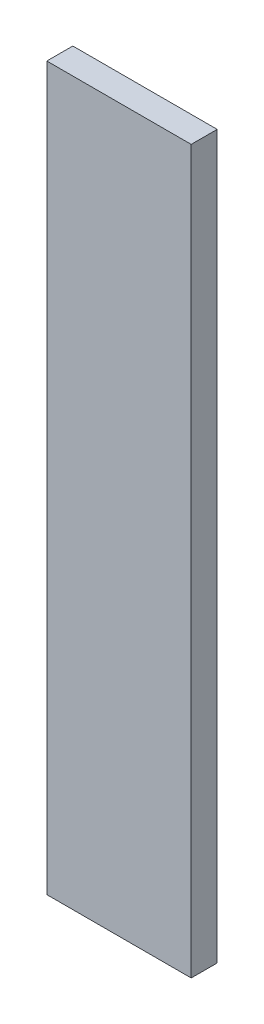
ISO-10303-21;
HEADER;
FILE_DESCRIPTION(('STEP AP214'),'2;1');
FILE_NAME('part.step','',(''),(''),'','','');
FILE_SCHEMA(('AUTOMOTIVE_DESIGN { 1 0 10303 214 1 1 1 1 }'));
ENDSEC;
DATA;
#1=APPLICATION_CONTEXT('core data for automotive mechanical design processes');
#2=APPLICATION_PROTOCOL_DEFINITION('international standard','automotive_design',2000,#1);
#3=PRODUCT_CONTEXT('',#1,'mechanical');
#4=PRODUCT('Part','Part','',(#3));
#5=PRODUCT_RELATED_PRODUCT_CATEGORY('part','',(#4));
#6=PRODUCT_DEFINITION_FORMATION('','',#4);
#7=PRODUCT_DEFINITION_CONTEXT('part definition',#1,'design');
#8=PRODUCT_DEFINITION('design','',#6,#7);
#9=PRODUCT_DEFINITION_SHAPE('','',#8);
#10=(LENGTH_UNIT() NAMED_UNIT(*) SI_UNIT(.MILLI.,.METRE.));
#11=(NAMED_UNIT(*) PLANE_ANGLE_UNIT() SI_UNIT($,.RADIAN.));
#12=(NAMED_UNIT(*) SI_UNIT($,.STERADIAN.) SOLID_ANGLE_UNIT());
#13=UNCERTAINTY_MEASURE_WITH_UNIT(LENGTH_MEASURE(1.E-05),#10,'distance_accuracy_value','');
#14=(GEOMETRIC_REPRESENTATION_CONTEXT(3) GLOBAL_UNCERTAINTY_ASSIGNED_CONTEXT((#13)) GLOBAL_UNIT_ASSIGNED_CONTEXT((#10,
#11,#12)) REPRESENTATION_CONTEXT('',''));
#15=CARTESIAN_POINT('',(0.,0.,0.));
#16=DIRECTION('',(0.,0.,1.));
#17=DIRECTION('',(1.,0.,0.));
#18=AXIS2_PLACEMENT_3D('',#15,#16,#17);
#19=CARTESIAN_POINT('',(0.,500.,0.));
#20=DIRECTION('',(1.,0.,0.));
#21=DIRECTION('',(0.,0.,-1.));
#22=AXIS2_PLACEMENT_3D('',#19,#20,#21);
#23=PLANE('',#22);
#24=DIRECTION('',(0.,0.,1.));
#25=VECTOR('',#24,1.);
#26=CARTESIAN_POINT('',(0.,0.,0.));
#27=LINE('',#26,#25);
#28=CARTESIAN_POINT('',(0.,0.,-18.));
#29=VERTEX_POINT('',#28);
#30=CARTESIAN_POINT('',(0.,0.,0.));
#31=VERTEX_POINT('',#30);
#32=EDGE_CURVE('E96',#29,#31,#27,.T.);
#33=ORIENTED_EDGE('',*,*,#32,.T.);
#34=DIRECTION('',(0.,-1.,0.));
#35=VECTOR('',#34,1.);
#36=CARTESIAN_POINT('',(0.,500.,0.));
#37=LINE('',#36,#35);
#38=CARTESIAN_POINT('',(0.,500.,0.));
#39=VERTEX_POINT('',#38);
#40=EDGE_CURVE('E11',#39,#31,#37,.T.);
#41=ORIENTED_EDGE('',*,*,#40,.F.);
#42=DIRECTION('',(0.,0.,1.));
#43=VECTOR('',#42,1.);
#44=CARTESIAN_POINT('',(0.,500.,0.));
#45=LINE('',#44,#43);
#46=CARTESIAN_POINT('',(0.,500.,-18.));
#47=VERTEX_POINT('',#46);
#48=EDGE_CURVE('E84',#47,#39,#45,.T.);
#49=ORIENTED_EDGE('',*,*,#48,.F.);
#50=DIRECTION('',(0.,-1.,0.));
#51=VECTOR('',#50,1.);
#52=CARTESIAN_POINT('',(0.,500.,-18.));
#53=LINE('',#52,#51);
#54=EDGE_CURVE('E92',#47,#29,#53,.T.);
#55=ORIENTED_EDGE('',*,*,#54,.T.);
#56=EDGE_LOOP('',(#33,#41,#49,#55));
#57=FACE_BOUND('',#56,.T.);
#58=ADVANCED_FACE('F33',(#57),#23,.F.);
#59=CARTESIAN_POINT('',(0.,500.,0.));
#60=DIRECTION('',(0.,0.,-1.));
#61=DIRECTION('',(-1.,0.,0.));
#62=AXIS2_PLACEMENT_3D('',#59,#60,#61);
#63=PLANE('',#62);
#64=DIRECTION('',(1.,0.,0.));
#65=VECTOR('',#64,1.);
#66=CARTESIAN_POINT('',(0.,0.,0.));
#67=LINE('',#66,#65);
#68=CARTESIAN_POINT('',(100.,0.,0.));
#69=VERTEX_POINT('',#68);
#70=EDGE_CURVE('E88',#31,#69,#67,.T.);
#71=ORIENTED_EDGE('',*,*,#70,.T.);
#72=DIRECTION('',(0.,-1.,0.));
#73=VECTOR('',#72,1.);
#74=CARTESIAN_POINT('',(100.,500.,0.));
#75=LINE('',#74,#73);
#76=CARTESIAN_POINT('',(100.,500.,0.));
#77=VERTEX_POINT('',#76);
#78=EDGE_CURVE('E41',#77,#69,#75,.T.);
#79=ORIENTED_EDGE('',*,*,#78,.F.);
#80=DIRECTION('',(1.,0.,0.));
#81=VECTOR('',#80,1.);
#82=CARTESIAN_POINT('',(0.,500.,0.));
#83=LINE('',#82,#81);
#84=EDGE_CURVE('E79',#39,#77,#83,.T.);
#85=ORIENTED_EDGE('',*,*,#84,.F.);
#86=ORIENTED_EDGE('',*,*,#40,.T.);
#87=EDGE_LOOP('',(#71,#79,#85,#86));
#88=FACE_BOUND('',#87,.T.);
#89=ADVANCED_FACE('F87',(#88),#63,.F.);
#90=CARTESIAN_POINT('',(100.,500.,0.));
#91=DIRECTION('',(-1.,0.,0.));
#92=DIRECTION('',(0.,0.,1.));
#93=AXIS2_PLACEMENT_3D('',#90,#91,#92);
#94=PLANE('',#93);
#95=DIRECTION('',(0.,0.,-1.));
#96=VECTOR('',#95,1.);
#97=CARTESIAN_POINT('',(100.,0.,0.));
#98=LINE('',#97,#96);
#99=CARTESIAN_POINT('',(100.,0.,-18.));
#100=VERTEX_POINT('',#99);
#101=EDGE_CURVE('E66',#69,#100,#98,.T.);
#102=ORIENTED_EDGE('',*,*,#101,.T.);
#103=DIRECTION('',(0.,-1.,0.));
#104=VECTOR('',#103,1.);
#105=CARTESIAN_POINT('',(100.,500.,-18.));
#106=LINE('',#105,#104);
#107=CARTESIAN_POINT('',(100.,500.,-18.));
#108=VERTEX_POINT('',#107);
#109=EDGE_CURVE('E89',#108,#100,#106,.T.);
#110=ORIENTED_EDGE('',*,*,#109,.F.);
#111=DIRECTION('',(0.,0.,-1.));
#112=VECTOR('',#111,1.);
#113=CARTESIAN_POINT('',(100.,500.,0.));
#114=LINE('',#113,#112);
#115=EDGE_CURVE('E82',#77,#108,#114,.T.);
#116=ORIENTED_EDGE('',*,*,#115,.F.);
#117=ORIENTED_EDGE('',*,*,#78,.T.);
#118=EDGE_LOOP('',(#102,#110,#116,#117));
#119=FACE_BOUND('',#118,.T.);
#120=ADVANCED_FACE('F90',(#119),#94,.F.);
#121=CARTESIAN_POINT('',(0.,500.,-18.));
#122=DIRECTION('',(0.,0.,1.));
#123=DIRECTION('',(1.,0.,0.));
#124=AXIS2_PLACEMENT_3D('',#121,#122,#123);
#125=PLANE('',#124);
#126=DIRECTION('',(-1.,0.,0.));
#127=VECTOR('',#126,1.);
#128=CARTESIAN_POINT('',(0.,0.,-18.));
#129=LINE('',#128,#127);
#130=EDGE_CURVE('E72',#100,#29,#129,.T.);
#131=ORIENTED_EDGE('',*,*,#130,.T.);
#132=ORIENTED_EDGE('',*,*,#54,.F.);
#133=DIRECTION('',(-1.,0.,0.));
#134=VECTOR('',#133,1.);
#135=CARTESIAN_POINT('',(0.,500.,-18.));
#136=LINE('',#135,#134);
#137=EDGE_CURVE('E49',#108,#47,#136,.T.);
#138=ORIENTED_EDGE('',*,*,#137,.F.);
#139=ORIENTED_EDGE('',*,*,#109,.T.);
#140=EDGE_LOOP('',(#131,#132,#138,#139));
#141=FACE_BOUND('',#140,.T.);
#142=ADVANCED_FACE('F103',(#141),#125,.F.);
#143=CARTESIAN_POINT('',(0.,500.,0.));
#144=DIRECTION('',(0.,-1.,0.));
#145=DIRECTION('',(0.,0.,-1.));
#146=AXIS2_PLACEMENT_3D('',#143,#144,#145);
#147=PLANE('',#146);
#148=ORIENTED_EDGE('',*,*,#48,.T.);
#149=ORIENTED_EDGE('',*,*,#84,.T.);
#150=ORIENTED_EDGE('',*,*,#115,.T.);
#151=ORIENTED_EDGE('',*,*,#137,.T.);
#152=EDGE_LOOP('',(#148,#149,#150,#151));
#153=FACE_BOUND('',#152,.T.);
#154=ADVANCED_FACE('F80',(#153),#147,.F.);
#155=CARTESIAN_POINT('',(0.,0.,0.));
#156=DIRECTION('',(0.,-1.,0.));
#157=DIRECTION('',(0.,0.,-1.));
#158=AXIS2_PLACEMENT_3D('',#155,#156,#157);
#159=PLANE('',#158);
#160=ORIENTED_EDGE('',*,*,#32,.F.);
#161=ORIENTED_EDGE('',*,*,#130,.F.);
#162=ORIENTED_EDGE('',*,*,#101,.F.);
#163=ORIENTED_EDGE('',*,*,#70,.F.);
#164=EDGE_LOOP('',(#160,#161,#162,#163));
#165=FACE_BOUND('',#164,.T.);
#166=ADVANCED_FACE('F106',(#165),#159,.T.);
#167=CLOSED_SHELL('',(#58,#89,#120,#142,#154,#166));
#168=MANIFOLD_SOLID_BREP('B2',#167);
#169=ADVANCED_BREP_SHAPE_REPRESENTATION('',(#18,#168),#14);
#170=SHAPE_DEFINITION_REPRESENTATION(#9,#169);
ENDSEC;
END-ISO-10303-21;
